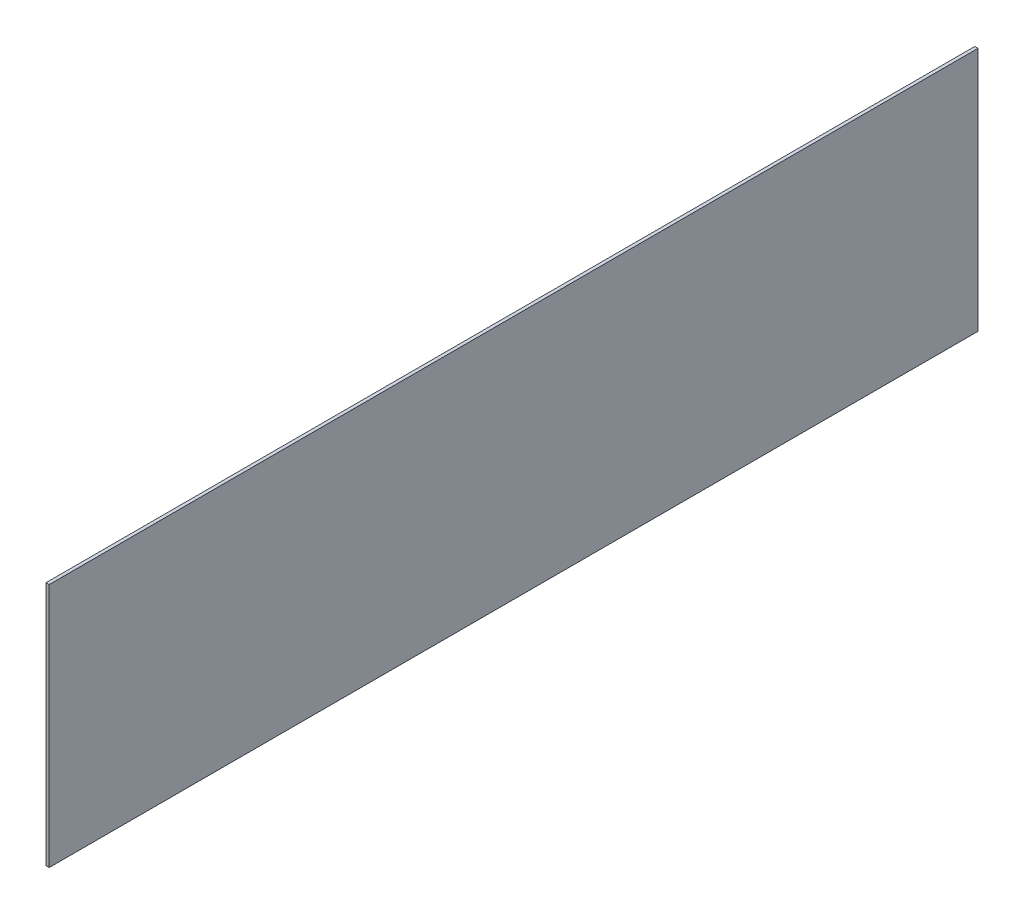
ISO-10303-21;
HEADER;
FILE_DESCRIPTION(('STEP AP214'),'2;1');
FILE_NAME('part.step','',(''),(''),'','','');
FILE_SCHEMA(('AUTOMOTIVE_DESIGN { 1 0 10303 214 1 1 1 1 }'));
ENDSEC;
DATA;
#1=APPLICATION_CONTEXT('core data for automotive mechanical design processes');
#2=APPLICATION_PROTOCOL_DEFINITION('international standard','automotive_design',2000,#1);
#3=PRODUCT_CONTEXT('',#1,'mechanical');
#4=PRODUCT('Part','Part','',(#3));
#5=PRODUCT_RELATED_PRODUCT_CATEGORY('part','',(#4));
#6=PRODUCT_DEFINITION_FORMATION('','',#4);
#7=PRODUCT_DEFINITION_CONTEXT('part definition',#1,'design');
#8=PRODUCT_DEFINITION('design','',#6,#7);
#9=PRODUCT_DEFINITION_SHAPE('','',#8);
#10=(LENGTH_UNIT() NAMED_UNIT(*) SI_UNIT(.MILLI.,.METRE.));
#11=(NAMED_UNIT(*) PLANE_ANGLE_UNIT() SI_UNIT($,.RADIAN.));
#12=(NAMED_UNIT(*) SI_UNIT($,.STERADIAN.) SOLID_ANGLE_UNIT());
#13=UNCERTAINTY_MEASURE_WITH_UNIT(LENGTH_MEASURE(1.E-05),#10,'distance_accuracy_value','');
#14=(GEOMETRIC_REPRESENTATION_CONTEXT(3) GLOBAL_UNCERTAINTY_ASSIGNED_CONTEXT((#13)) GLOBAL_UNIT_ASSIGNED_CONTEXT((#10,
#11,#12)) REPRESENTATION_CONTEXT('',''));
#15=CARTESIAN_POINT('',(0.,0.,0.));
#16=DIRECTION('',(0.,0.,1.));
#17=DIRECTION('',(1.,0.,0.));
#18=AXIS2_PLACEMENT_3D('',#15,#16,#17);
#19=CARTESIAN_POINT('',(0.,0.,0.));
#20=DIRECTION('',(1.,0.,0.));
#21=DIRECTION('',(0.,0.,-1.));
#22=AXIS2_PLACEMENT_3D('',#19,#20,#21);
#23=PLANE('',#22);
#24=DIRECTION('',(0.,1.,0.));
#25=VECTOR('',#24,1.);
#26=CARTESIAN_POINT('',(0.,482.6,0.));
#27=LINE('',#26,#25);
#28=CARTESIAN_POINT('',(0.,482.6,0.));
#29=VERTEX_POINT('',#28);
#30=CARTESIAN_POINT('',(0.,0.,0.));
#31=VERTEX_POINT('',#30);
#32=EDGE_CURVE('E95',#29,#31,#27,.F.);
#33=ORIENTED_EDGE('',*,*,#32,.F.);
#34=DIRECTION('',(0.,0.,1.));
#35=VECTOR('',#34,1.);
#36=CARTESIAN_POINT('',(0.,482.6,-1828.8));
#37=LINE('',#36,#35);
#38=CARTESIAN_POINT('',(0.,482.6,-1828.8));
#39=VERTEX_POINT('',#38);
#40=EDGE_CURVE('E71',#39,#29,#37,.T.);
#41=ORIENTED_EDGE('',*,*,#40,.F.);
#42=DIRECTION('',(0.,1.,0.));
#43=VECTOR('',#42,1.);
#44=CARTESIAN_POINT('',(0.,0.,-1828.8));
#45=LINE('',#44,#43);
#46=CARTESIAN_POINT('',(0.,0.,-1828.8));
#47=VERTEX_POINT('',#46);
#48=EDGE_CURVE('E73',#47,#39,#45,.T.);
#49=ORIENTED_EDGE('',*,*,#48,.F.);
#50=DIRECTION('',(0.,0.,-1.));
#51=VECTOR('',#50,1.);
#52=CARTESIAN_POINT('',(0.,0.,0.));
#53=LINE('',#52,#51);
#54=EDGE_CURVE('E36',#31,#47,#53,.T.);
#55=ORIENTED_EDGE('',*,*,#54,.F.);
#56=EDGE_LOOP('',(#33,#41,#49,#55));
#57=FACE_BOUND('',#56,.T.);
#58=ADVANCED_FACE('F33',(#57),#23,.F.);
#59=CARTESIAN_POINT('',(0.,0.,0.));
#60=DIRECTION('',(0.,-1.,0.));
#61=DIRECTION('',(0.,0.,-1.));
#62=AXIS2_PLACEMENT_3D('',#59,#60,#61);
#63=PLANE('',#62);
#64=DIRECTION('',(0.,0.,-1.));
#65=VECTOR('',#64,1.);
#66=CARTESIAN_POINT('',(6.35,0.,0.));
#67=LINE('',#66,#65);
#68=CARTESIAN_POINT('',(6.35,0.,0.));
#69=VERTEX_POINT('',#68);
#70=CARTESIAN_POINT('',(6.35,0.,-1828.8));
#71=VERTEX_POINT('',#70);
#72=EDGE_CURVE('E99',#69,#71,#67,.T.);
#73=ORIENTED_EDGE('',*,*,#72,.F.);
#74=DIRECTION('',(1.,0.,0.));
#75=VECTOR('',#74,1.);
#76=CARTESIAN_POINT('',(0.,0.,0.));
#77=LINE('',#76,#75);
#78=EDGE_CURVE('E84',#31,#69,#77,.T.);
#79=ORIENTED_EDGE('',*,*,#78,.F.);
#80=ORIENTED_EDGE('',*,*,#54,.T.);
#81=DIRECTION('',(-1.,0.,0.));
#82=VECTOR('',#81,1.);
#83=CARTESIAN_POINT('',(0.,0.,-1828.8));
#84=LINE('',#83,#82);
#85=EDGE_CURVE('E79',#71,#47,#84,.T.);
#86=ORIENTED_EDGE('',*,*,#85,.F.);
#87=EDGE_LOOP('',(#73,#79,#80,#86));
#88=FACE_BOUND('',#87,.T.);
#89=ADVANCED_FACE('F81',(#88),#63,.T.);
#90=CARTESIAN_POINT('',(0.,0.,-1828.8));
#91=DIRECTION('',(0.,0.,-1.));
#92=DIRECTION('',(-1.,0.,0.));
#93=AXIS2_PLACEMENT_3D('',#90,#91,#92);
#94=PLANE('',#93);
#95=DIRECTION('',(0.,1.,0.));
#96=VECTOR('',#95,1.);
#97=CARTESIAN_POINT('',(6.35,0.,-1828.8));
#98=LINE('',#97,#96);
#99=CARTESIAN_POINT('',(6.35,482.6,-1828.8));
#100=VERTEX_POINT('',#99);
#101=EDGE_CURVE('E88',#71,#100,#98,.T.);
#102=ORIENTED_EDGE('',*,*,#101,.F.);
#103=ORIENTED_EDGE('',*,*,#85,.T.);
#104=ORIENTED_EDGE('',*,*,#48,.T.);
#105=DIRECTION('',(1.,0.,0.));
#106=VECTOR('',#105,1.);
#107=CARTESIAN_POINT('',(0.,482.6,-1828.8));
#108=LINE('',#107,#106);
#109=EDGE_CURVE('E91',#100,#39,#108,.F.);
#110=ORIENTED_EDGE('',*,*,#109,.F.);
#111=EDGE_LOOP('',(#102,#103,#104,#110));
#112=FACE_BOUND('',#111,.T.);
#113=ADVANCED_FACE('F86',(#112),#94,.T.);
#114=CARTESIAN_POINT('',(0.,482.6,-1828.8));
#115=DIRECTION('',(0.,1.,0.));
#116=DIRECTION('',(0.,0.,1.));
#117=AXIS2_PLACEMENT_3D('',#114,#115,#116);
#118=PLANE('',#117);
#119=DIRECTION('',(0.,0.,-1.));
#120=VECTOR('',#119,1.);
#121=CARTESIAN_POINT('',(6.35,482.6,0.));
#122=LINE('',#121,#120);
#123=CARTESIAN_POINT('',(6.35,482.6,0.));
#124=VERTEX_POINT('',#123);
#125=EDGE_CURVE('E42',#100,#124,#122,.F.);
#126=ORIENTED_EDGE('',*,*,#125,.F.);
#127=ORIENTED_EDGE('',*,*,#109,.T.);
#128=ORIENTED_EDGE('',*,*,#40,.T.);
#129=DIRECTION('',(1.,0.,0.));
#130=VECTOR('',#129,1.);
#131=CARTESIAN_POINT('',(0.,482.6,0.));
#132=LINE('',#131,#130);
#133=EDGE_CURVE('E51',#124,#29,#132,.F.);
#134=ORIENTED_EDGE('',*,*,#133,.F.);
#135=EDGE_LOOP('',(#126,#127,#128,#134));
#136=FACE_BOUND('',#135,.T.);
#137=ADVANCED_FACE('F105',(#136),#118,.T.);
#138=CARTESIAN_POINT('',(0.,482.6,0.));
#139=DIRECTION('',(0.,0.,1.));
#140=DIRECTION('',(1.,0.,0.));
#141=AXIS2_PLACEMENT_3D('',#138,#139,#140);
#142=PLANE('',#141);
#143=DIRECTION('',(0.,1.,0.));
#144=VECTOR('',#143,1.);
#145=CARTESIAN_POINT('',(6.35,0.,0.));
#146=LINE('',#145,#144);
#147=EDGE_CURVE('E11',#124,#69,#146,.F.);
#148=ORIENTED_EDGE('',*,*,#147,.F.);
#149=ORIENTED_EDGE('',*,*,#133,.T.);
#150=ORIENTED_EDGE('',*,*,#32,.T.);
#151=ORIENTED_EDGE('',*,*,#78,.T.);
#152=EDGE_LOOP('',(#148,#149,#150,#151));
#153=FACE_BOUND('',#152,.T.);
#154=ADVANCED_FACE('F107',(#153),#142,.T.);
#155=CARTESIAN_POINT('',(6.35,0.,0.));
#156=DIRECTION('',(1.,0.,0.));
#157=DIRECTION('',(0.,0.,-1.));
#158=AXIS2_PLACEMENT_3D('',#155,#156,#157);
#159=PLANE('',#158);
#160=ORIENTED_EDGE('',*,*,#125,.T.);
#161=ORIENTED_EDGE('',*,*,#147,.T.);
#162=ORIENTED_EDGE('',*,*,#72,.T.);
#163=ORIENTED_EDGE('',*,*,#101,.T.);
#164=EDGE_LOOP('',(#160,#161,#162,#163));
#165=FACE_BOUND('',#164,.T.);
#166=ADVANCED_FACE('F104',(#165),#159,.T.);
#167=CLOSED_SHELL('',(#58,#89,#113,#137,#154,#166));
#168=MANIFOLD_SOLID_BREP('B2',#167);
#169=ADVANCED_BREP_SHAPE_REPRESENTATION('',(#18,#168),#14);
#170=SHAPE_DEFINITION_REPRESENTATION(#9,#169);
ENDSEC;
END-ISO-10303-21;
